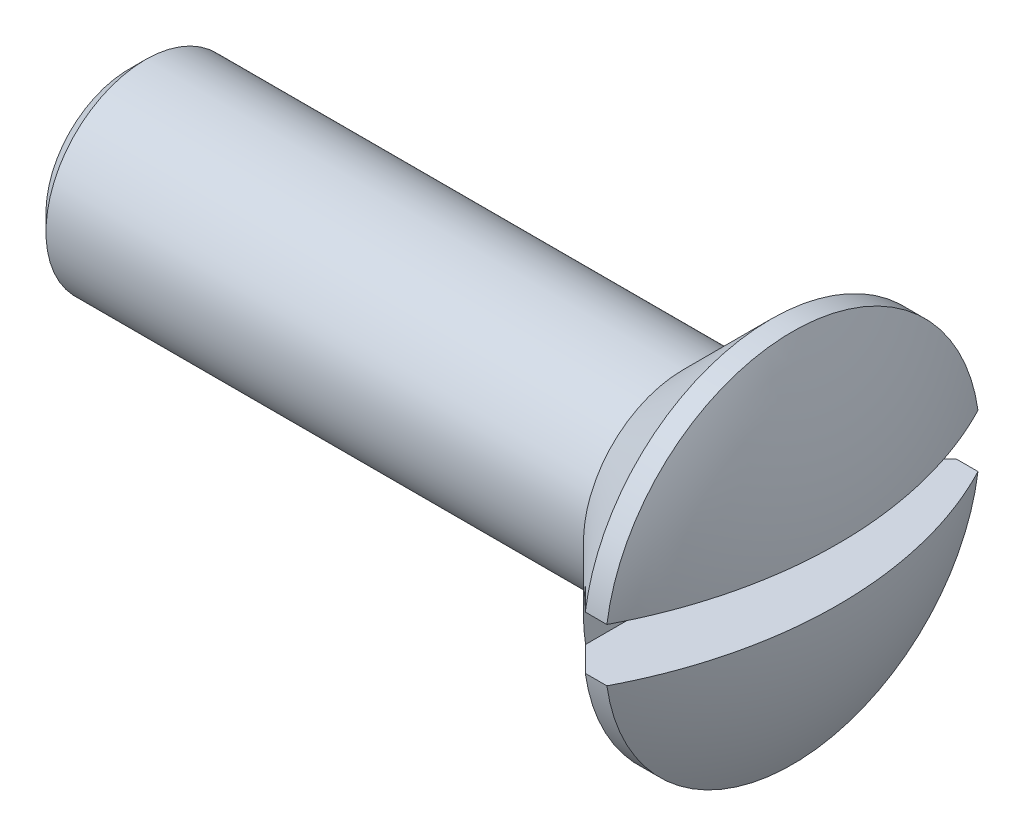
ISO-10303-21;
HEADER;
FILE_DESCRIPTION(('STEP AP214'),'2;1');
FILE_NAME('part.step','',(''),(''),'','','');
FILE_SCHEMA(('AUTOMOTIVE_DESIGN { 1 0 10303 214 1 1 1 1 }'));
ENDSEC;
DATA;
#1=APPLICATION_CONTEXT('core data for automotive mechanical design processes');
#2=APPLICATION_PROTOCOL_DEFINITION('international standard','automotive_design',2000,#1);
#3=PRODUCT_CONTEXT('',#1,'mechanical');
#4=PRODUCT('Part','Part','',(#3));
#5=PRODUCT_RELATED_PRODUCT_CATEGORY('part','',(#4));
#6=PRODUCT_DEFINITION_FORMATION('','',#4);
#7=PRODUCT_DEFINITION_CONTEXT('part definition',#1,'design');
#8=PRODUCT_DEFINITION('design','',#6,#7);
#9=PRODUCT_DEFINITION_SHAPE('','',#8);
#10=(LENGTH_UNIT() NAMED_UNIT(*) SI_UNIT(.MILLI.,.METRE.));
#11=(NAMED_UNIT(*) PLANE_ANGLE_UNIT() SI_UNIT($,.RADIAN.));
#12=(NAMED_UNIT(*) SI_UNIT($,.STERADIAN.) SOLID_ANGLE_UNIT());
#13=UNCERTAINTY_MEASURE_WITH_UNIT(LENGTH_MEASURE(1.E-05),#10,'distance_accuracy_value','');
#14=(GEOMETRIC_REPRESENTATION_CONTEXT(3) GLOBAL_UNCERTAINTY_ASSIGNED_CONTEXT((#13)) GLOBAL_UNIT_ASSIGNED_CONTEXT((#10,
#11,#12)) REPRESENTATION_CONTEXT('',''));
#15=CARTESIAN_POINT('',(0.,0.,0.));
#16=DIRECTION('',(0.,0.,1.));
#17=DIRECTION('',(1.,0.,0.));
#18=AXIS2_PLACEMENT_3D('',#15,#16,#17);
#19=CARTESIAN_POINT('',(-12.1008928571429,0.,0.));
#20=DIRECTION('',(1.,0.,0.));
#21=DIRECTION('',(0.,-1.,0.));
#22=AXIS2_PLACEMENT_3D('',#19,#20,#21);
#23=SPHERICAL_SURFACE('',#22,12.1008928571429);
#24=CARTESIAN_POINT('',(-12.1008928571429,0.8,0.));
#25=DIRECTION('',(0.,1.,0.));
#26=DIRECTION('',(0.,0.,1.));
#27=AXIS2_PLACEMENT_3D('',#24,#25,#26);
#28=CIRCLE('',#27,12.0744195694887);
#29=CARTESIAN_POINT('',(-1.4,0.8,-5.593076076722));
#30=VERTEX_POINT('',#29);
#31=CARTESIAN_POINT('',(-1.4,0.799999999999999,5.59307607672201));
#32=VERTEX_POINT('',#31);
#33=EDGE_CURVE('E181',#30,#32,#28,.F.);
#34=ORIENTED_EDGE('',*,*,#33,.F.);
#35=CARTESIAN_POINT('',(-1.4,0.,0.));
#36=DIRECTION('',(1.,0.,0.));
#37=DIRECTION('',(0.,1.,0.));
#38=AXIS2_PLACEMENT_3D('',#35,#36,#37);
#39=CIRCLE('',#38,5.65);
#40=EDGE_CURVE('E172',#30,#32,#39,.T.);
#41=ORIENTED_EDGE('',*,*,#40,.T.);
#42=EDGE_LOOP('',(#34,#41));
#43=FACE_BOUND('',#42,.T.);
#44=ADVANCED_FACE('F36',(#43),#23,.T.);
#45=CARTESIAN_POINT('',(0.,0.,0.));
#46=DIRECTION('',(1.,0.,0.));
#47=DIRECTION('',(0.,1.,0.));
#48=AXIS2_PLACEMENT_3D('',#45,#46,#47);
#49=CYLINDRICAL_SURFACE('',#48,5.65);
#50=DIRECTION('',(1.,0.,0.));
#51=VECTOR('',#50,1.);
#52=CARTESIAN_POINT('',(0.,0.799999999999999,5.593076076722));
#53=LINE('',#52,#51);
#54=CARTESIAN_POINT('',(-2.04999999999997,0.799999999999999,5.593076076722));
#55=VERTEX_POINT('',#54);
#56=EDGE_CURVE('E59',#32,#55,#53,.F.);
#57=ORIENTED_EDGE('',*,*,#56,.F.);
#58=ORIENTED_EDGE('',*,*,#40,.F.);
#59=DIRECTION('',(1.,0.,0.));
#60=VECTOR('',#59,1.);
#61=CARTESIAN_POINT('',(0.,0.800000000000001,-5.593076076722));
#62=LINE('',#61,#60);
#63=CARTESIAN_POINT('',(-2.04999999999997,0.800000000000001,-5.59307607672201));
#64=VERTEX_POINT('',#63);
#65=EDGE_CURVE('E183',#64,#30,#62,.T.);
#66=ORIENTED_EDGE('',*,*,#65,.F.);
#67=CARTESIAN_POINT('',(-2.04999999999997,0.,0.));
#68=DIRECTION('',(1.,0.,0.));
#69=DIRECTION('',(0.,1.,0.));
#70=AXIS2_PLACEMENT_3D('',#67,#68,#69);
#71=CIRCLE('',#70,5.65);
#72=EDGE_CURVE('E110',#64,#55,#71,.T.);
#73=ORIENTED_EDGE('',*,*,#72,.T.);
#74=EDGE_LOOP('',(#57,#58,#66,#73));
#75=FACE_BOUND('',#74,.T.);
#76=ADVANCED_FACE('F149',(#75),#49,.T.);
#77=CARTESIAN_POINT('',(-12.1008928571429,-0.800000000000001,0.));
#78=DIRECTION('',(0.,-1.,0.));
#79=DIRECTION('',(0.,0.,-1.));
#80=AXIS2_PLACEMENT_3D('',#77,#78,#79);
#81=CIRCLE('',#80,12.0744195694887);
#82=CARTESIAN_POINT('',(-1.4,-0.800000000000001,5.593076076722));
#83=VERTEX_POINT('',#82);
#84=CARTESIAN_POINT('',(-1.4,-0.800000000000001,-5.59307607672201));
#85=VERTEX_POINT('',#84);
#86=EDGE_CURVE('E165',#83,#85,#81,.F.);
#87=ORIENTED_EDGE('',*,*,#86,.F.);
#88=EDGE_CURVE('E97',#83,#85,#39,.T.);
#89=ORIENTED_EDGE('',*,*,#88,.T.);
#90=EDGE_LOOP('',(#87,#89));
#91=FACE_BOUND('',#90,.T.);
#92=ADVANCED_FACE('F151',(#91),#23,.T.);
#93=DIRECTION('',(1.,0.,0.));
#94=VECTOR('',#93,1.);
#95=CARTESIAN_POINT('',(0.,-0.800000000000001,-5.593076076722));
#96=LINE('',#95,#94);
#97=CARTESIAN_POINT('',(-2.04999999999997,-0.800000000000001,-5.593076076722));
#98=VERTEX_POINT('',#97);
#99=EDGE_CURVE('E168',#85,#98,#96,.F.);
#100=ORIENTED_EDGE('',*,*,#99,.F.);
#101=ORIENTED_EDGE('',*,*,#88,.F.);
#102=DIRECTION('',(1.,0.,0.));
#103=VECTOR('',#102,1.);
#104=CARTESIAN_POINT('',(0.,-0.800000000000001,5.593076076722));
#105=LINE('',#104,#103);
#106=CARTESIAN_POINT('',(-2.04999999999997,-0.800000000000001,5.59307607672201));
#107=VERTEX_POINT('',#106);
#108=EDGE_CURVE('E104',#107,#83,#105,.T.);
#109=ORIENTED_EDGE('',*,*,#108,.F.);
#110=EDGE_CURVE('E174',#107,#98,#71,.T.);
#111=ORIENTED_EDGE('',*,*,#110,.T.);
#112=EDGE_LOOP('',(#100,#101,#109,#111));
#113=FACE_BOUND('',#112,.T.);
#114=ADVANCED_FACE('F146',(#113),#49,.T.);
#115=CARTESIAN_POINT('',(-2.04999999999997,0.,0.));
#116=DIRECTION('',(1.,0.,0.));
#117=DIRECTION('',(0.,1.,0.));
#118=AXIS2_PLACEMENT_3D('',#115,#116,#117);
#119=CONICAL_SURFACE('',#118,5.65,0.785398163397443);
#120=CARTESIAN_POINT('',(4.74511721803882,0.799999999999998,12.4193777046486));
#121=CARTESIAN_POINT('',(4.31965428081456,0.799999999999998,11.9930261174784));
#122=CARTESIAN_POINT('',(3.89423019783678,0.799999999999998,11.5666357327711));
#123=CARTESIAN_POINT('',(3.04350138460033,0.799999999999999,10.7137200151019));
#124=CARTESIAN_POINT('',(2.618196656722,0.799999999999999,10.2871946797658));
#125=CARTESIAN_POINT('',(1.76761959018061,0.799999999999999,9.43382265086454));
#126=CARTESIAN_POINT('',(1.34234731165592,0.799999999999999,9.00697589734771));
#127=CARTESIAN_POINT('',(0.492080541455805,0.799999999999999,8.15302128871153));
#128=CARTESIAN_POINT('',(0.0670860448579515,0.799999999999999,7.72591343849361));
#129=CARTESIAN_POINT('',(-0.78963684892412,0.799999999999999,6.86406659123412));
#130=CARTESIAN_POINT('',(-1.2213579628236,0.799999999999999,6.429320349768));
#131=CARTESIAN_POINT('',(-1.86834723495549,0.799999999999999,5.77658920407237));
#132=CARTESIAN_POINT('',(-2.08391769672665,0.799999999999999,5.55890401037255));
#133=CARTESIAN_POINT('',(-2.51476815248159,0.799999999999999,5.12324874008263));
#134=CARTESIAN_POINT('',(-2.73004814809955,0.799999999999999,4.90527866510898));
#135=CARTESIAN_POINT('',(-3.16014687532004,0.799999999999999,4.46896214090299));
#136=CARTESIAN_POINT('',(-3.37496568408039,0.799999999999999,4.25061576779427));
#137=CARTESIAN_POINT('',(-3.80394775538658,0.799999999999999,3.81327065478524));
#138=CARTESIAN_POINT('',(-4.01811100364353,0.799999999999999,3.59427190086775));
#139=CARTESIAN_POINT('',(-4.44532996157782,0.799999999999999,3.15523557952812));
#140=CARTESIAN_POINT('',(-4.65838577961601,0.8,2.93519811792176));
#141=CARTESIAN_POINT('',(-4.97639888685975,0.8,2.60364168362365));
#142=CARTESIAN_POINT('',(-5.08213965232862,0.8,2.49287478015279));
#143=CARTESIAN_POINT('',(-5.29284667886347,0.8,2.27060738855942));
#144=CARTESIAN_POINT('',(-5.39781295004355,0.8,2.15910691005274));
#145=CARTESIAN_POINT('',(-5.55868942682353,0.8,1.98637654903117));
#146=CARTESIAN_POINT('',(-5.61502257289671,0.8,1.92554080526949));
#147=CARTESIAN_POINT('',(-5.7272199889609,0.8,1.80345308435218));
#148=CARTESIAN_POINT('',(-5.78308432176076,0.8,1.74220116500932));
#149=CARTESIAN_POINT('',(-5.89413663694359,0.8,1.61920981712621));
#150=CARTESIAN_POINT('',(-5.9493253013881,0.8,1.55747100535111));
#151=CARTESIAN_POINT('',(-6.05888369735553,0.8,1.43322225898995));
#152=CARTESIAN_POINT('',(-6.11325307835141,0.8,1.37071201405123));
#153=CARTESIAN_POINT('',(-6.2051355945914,0.8,1.26299679876909));
#154=CARTESIAN_POINT('',(-6.24294999126803,0.8,1.21804923332391));
#155=CARTESIAN_POINT('',(-6.31776697990897,0.8,1.12748441978479));
#156=CARTESIAN_POINT('',(-6.35476960976467,0.8,1.08186720311521));
#157=CARTESIAN_POINT('',(-6.42764540486493,0.8,0.989787004296026));
#158=CARTESIAN_POINT('',(-6.46351933039841,0.8,0.943324626242543));
#159=CARTESIAN_POINT('',(-6.53371099529902,0.8,0.849243952042077));
#160=CARTESIAN_POINT('',(-6.56802909538034,0.8,0.801625927800229));
#161=CARTESIAN_POINT('',(-6.62534497472906,0.8,0.718009680275494));
#162=CARTESIAN_POINT('',(-6.64887916280529,0.8,0.682381084873747));
#163=CARTESIAN_POINT('',(-6.69431930071865,0.8,0.610071066089829));
#164=CARTESIAN_POINT('',(-6.71622460122795,0.8,0.573389230843016));
#165=CARTESIAN_POINT('',(-6.75772214328742,0.8,0.498842623233365));
#166=CARTESIAN_POINT('',(-6.77732012108295,0.8,0.460981093679832));
#167=CARTESIAN_POINT('',(-6.81335502284584,0.8,0.383800793568388));
#168=CARTESIAN_POINT('',(-6.82979476967974,0.8,0.344483362166101));
#169=CARTESIAN_POINT('',(-6.86080824970358,0.8,0.257246564055197));
#170=CARTESIAN_POINT('',(-6.87455984774782,0.8,0.209020647026232));
#171=CARTESIAN_POINT('',(-6.8937443017867,0.8,0.111028625146763));
#172=CARTESIAN_POINT('',(-6.8992079262586,0.8,0.061268920182349));
#173=CARTESIAN_POINT('',(-6.90063200223829,0.8,-0.0386352838175578));
#174=CARTESIAN_POINT('',(-6.896547030816,0.8,-0.088780486439219));
#175=CARTESIAN_POINT('',(-6.87974801427453,0.8,-0.187657442577815));
#176=CARTESIAN_POINT('',(-6.86700822610088,0.8,-0.236384525830764));
#177=CARTESIAN_POINT('',(-6.83440007195934,0.8,-0.333895648179295));
#178=CARTESIAN_POINT('',(-6.81421894717466,0.8,-0.382570201245262));
#179=CARTESIAN_POINT('',(-6.76915839209305,0.8,-0.477730851740294));
#180=CARTESIAN_POINT('',(-6.74427023771472,0.8,-0.524212682023572));
#181=CARTESIAN_POINT('',(-6.69118485707923,0.8,-0.615715711259509));
#182=CARTESIAN_POINT('',(-6.66296252652258,0.8,-0.660722079875186));
#183=CARTESIAN_POINT('',(-6.60441466956097,0.8,-0.749270842542499));
#184=CARTESIAN_POINT('',(-6.57409101625924,0.8,-0.792814490318945));
#185=CARTESIAN_POINT('',(-6.50916500430662,0.8,-0.882688386326956));
#186=CARTESIAN_POINT('',(-6.47442309355845,0.8,-0.928917111859847));
#187=CARTESIAN_POINT('',(-6.40369359299834,0.8,-1.020414939396));
#188=CARTESIAN_POINT('',(-6.36770583696376,0.8,-1.06568391203822));
#189=CARTESIAN_POINT('',(-6.25837390257271,0.8,-1.20044803741514));
#190=CARTESIAN_POINT('',(-6.18369408583194,0.8,-1.28885621705901));
#191=CARTESIAN_POINT('',(-6.03218900720606,0.8,-1.46406956516393));
#192=CARTESIAN_POINT('',(-5.95536013554961,0.8,-1.55087157206465));
#193=CARTESIAN_POINT('',(-5.80044200408463,0.8,-1.7232967265519));
#194=CARTESIAN_POINT('',(-5.72235311046476,0.8,-1.80892020370154));
#195=CARTESIAN_POINT('',(-5.56557313070317,0.8,-1.97910707253248));
#196=CARTESIAN_POINT('',(-5.48688476050643,0.8,-2.0636729747183));
#197=CARTESIAN_POINT('',(-5.32890649963365,0.8,-2.23225181172137));
#198=CARTESIAN_POINT('',(-5.24961656615959,0.8,-2.31626470638572));
#199=CARTESIAN_POINT('',(-5.09068838648789,0.8,-2.48378883237718));
#200=CARTESIAN_POINT('',(-5.01105060497988,0.8,-2.56730050505255));
#201=CARTESIAN_POINT('',(-4.85145101596008,0.8,-2.73400954986337));
#202=CARTESIAN_POINT('',(-4.77148921635787,0.8,-2.81720692957635));
#203=CARTESIAN_POINT('',(-4.53194285830772,0.8,-3.06570369800665));
#204=CARTESIAN_POINT('',(-4.37199116453664,0.8,-3.2306490556862));
#205=CARTESIAN_POINT('',(-4.05147042474374,0.8,-3.55993915125416));
#206=CARTESIAN_POINT('',(-3.89090137619788,0.8,-3.7242838866816));
#207=CARTESIAN_POINT('',(-3.40857672940065,0.8,-4.21672523304258));
#208=CARTESIAN_POINT('',(-3.08620970625256,0.8,-4.5442227183829));
#209=CARTESIAN_POINT('',(-2.44051808318878,0.8,-5.1985440376961));
#210=CARTESIAN_POINT('',(-2.11719313614472,0.800000000000001,-5.52536752845678));
#211=CARTESIAN_POINT('',(-1.47005512418724,0.800000000000001,-6.17852514292794));
#212=CARTESIAN_POINT('',(-1.14624206363371,0.800000000000001,-6.50485927095814));
#213=CARTESIAN_POINT('',(-0.498300290172085,0.800000000000001,-7.15722750433832));
#214=CARTESIAN_POINT('',(-0.174171570767393,0.800000000000001,-7.48326160323279));
#215=CARTESIAN_POINT('',(0.474296117584435,0.800000000000001,-8.13512214110996));
#216=CARTESIAN_POINT('',(0.798635087020347,0.800000000000001,-8.46094857960639));
#217=CARTESIAN_POINT('',(1.77180053441267,0.800000000000001,-9.43814275340889));
#218=CARTESIAN_POINT('',(2.42084408883513,0.800000000000001,-10.089294290581));
#219=CARTESIAN_POINT('',(3.20961021995901,0.800000000000001,-10.88024332919));
#220=CARTESIAN_POINT('',(3.34918416051201,0.800000000000001,-11.0201891314621));
#221=CARTESIAN_POINT('',(3.62834785708027,0.800000000000001,-11.3000693616298));
#222=CARTESIAN_POINT('',(3.76793761331009,0.800000000000001,-11.4400037893113));
#223=CARTESIAN_POINT('',(4.04712055068098,0.800000000000001,-11.7198521163181));
#224=CARTESIAN_POINT('',(4.18671373108782,0.800000000000001,-11.8597660163758));
#225=CARTESIAN_POINT('',(4.46590873012772,0.800000000000001,-12.139580792689));
#226=CARTESIAN_POINT('',(4.60551054858975,0.800000000000001,-12.2794816691152));
#227=CARTESIAN_POINT('',(4.74511721803882,0.800000000000001,-12.4193777046486));
#228=B_SPLINE_CURVE_WITH_KNOTS('',3,(#120,#121,#122,#123,#124,#125,#126,#127,#128,#129,#130,
#131,#132,#133,#134,#135,#136,#137,#138,#139,#140,#141,#142,#143,#144,#145,#146,#147,#148,#149,
#150,#151,#152,#153,#154,#155,#156,#157,#158,#159,#160,#161,#162,#163,#164,#165,#166,#167,#168,
#169,#170,#171,#172,#173,#174,#175,#176,#177,#178,#179,#180,#181,#182,#183,#184,#185,#186,#187,
#188,#189,#190,#191,#192,#193,#194,#195,#196,#197,#198,#199,#200,#201,#202,#203,#204,#205,#206,
#207,#208,#209,#210,#211,#212,#213,#214,#215,#216,#217,#218,#219,#220,#221,#222,#223,#224,#225,
#226,#227),.UNSPECIFIED.,.F.,.F.,(4,2,2,2,2,2,2,2,2,2,2,2,2,2,2,2,2,2,2,2,2,2,2,2,2,2,2,2,2,2,2,
2,2,2,2,2,2,2,2,2,2,2,2,2,2,2,2,2,2,2,2,2,2,4),(0.,1.80697248490011,3.61397875582152,
5.42159918859865,7.22918667047184,9.06725200042542,9.98633678885604,10.905416384759,
11.8243278948188,12.7432592932796,13.6620990155401,14.1215028247628,14.5809006239894,
14.8296351425722,15.0783357873934,15.3267603101018,15.5752882636484,15.7514970614197,
15.9276976166011,16.1037768261759,16.279815001247,16.4078816960601,16.5359991717675,
16.663791089444,16.7914682481759,16.9413565033334,17.0906869359896,17.2407291822401,
17.391219682418,17.5489321863173,17.7069399135551,17.8662239005987,18.0253676855117,
18.1988222163427,18.3722999796253,18.7194208466329,19.0671646694091,19.4148091885248,
19.7613446235477,20.1079049483285,20.4540936403047,20.8002739317796,21.4895630232171,
22.1788549357825,23.5574649448377,24.9366576112049,26.3158380305883,27.695047461635,
29.0742601105742,31.8323937662066,32.4253452100396,33.0183059969787,33.6112304428302,
34.2041455344664),.UNSPECIFIED.);
#229=CARTESIAN_POINT('',(-2.8,0.799999999999999,4.83425278610871));
#230=VERTEX_POINT('',#229);
#231=EDGE_CURVE('E103',#55,#230,#228,.T.);
#232=ORIENTED_EDGE('',*,*,#231,.F.);
#233=ORIENTED_EDGE('',*,*,#72,.F.);
#234=CARTESIAN_POINT('',(-2.8,0.8,-4.83425278610871));
#235=VERTEX_POINT('',#234);
#236=EDGE_CURVE('E101',#235,#64,#228,.T.);
#237=ORIENTED_EDGE('',*,*,#236,.F.);
#238=CARTESIAN_POINT('',(-2.8,0.,0.));
#239=DIRECTION('',(1.,0.,0.));
#240=DIRECTION('',(0.,0.,-1.));
#241=AXIS2_PLACEMENT_3D('',#238,#239,#240);
#242=CIRCLE('',#241,4.89999999999998);
#243=CARTESIAN_POINT('',(-2.8,-0.800000000000001,-4.83425278610871));
#244=VERTEX_POINT('',#243);
#245=EDGE_CURVE('E88',#235,#244,#242,.F.);
#246=ORIENTED_EDGE('',*,*,#245,.T.);
#247=CARTESIAN_POINT('',(4.74511721803882,-0.800000000000001,-12.4193777046486));
#248=CARTESIAN_POINT('',(4.31965428081456,-0.800000000000001,-11.9930261174784));
#249=CARTESIAN_POINT('',(3.89423019783678,-0.800000000000001,-11.5666357327711));
#250=CARTESIAN_POINT('',(3.04350138460033,-0.800000000000001,-10.7137200151019));
#251=CARTESIAN_POINT('',(2.618196656722,-0.800000000000001,-10.2871946797658));
#252=CARTESIAN_POINT('',(1.76761959018061,-0.800000000000001,-9.43382265086454));
#253=CARTESIAN_POINT('',(1.34234731165592,-0.800000000000001,-9.00697589734771));
#254=CARTESIAN_POINT('',(0.492080541455804,-0.800000000000001,-8.15302128871153));
#255=CARTESIAN_POINT('',(0.0670860448579505,-0.800000000000001,-7.72591343849361));
#256=CARTESIAN_POINT('',(-0.789636848924121,-0.800000000000001,-6.86406659123412));
#257=CARTESIAN_POINT('',(-1.2213579628236,-0.800000000000001,-6.429320349768));
#258=CARTESIAN_POINT('',(-1.86834723495549,-0.800000000000001,-5.77658920407237));
#259=CARTESIAN_POINT('',(-2.08391769672665,-0.800000000000001,-5.55890401037255));
#260=CARTESIAN_POINT('',(-2.51476815248159,-0.800000000000001,-5.12324874008263));
#261=CARTESIAN_POINT('',(-2.73004814809955,-0.800000000000001,-4.90527866510898));
#262=CARTESIAN_POINT('',(-3.16014687532004,-0.800000000000001,-4.46896214090299));
#263=CARTESIAN_POINT('',(-3.37496568408039,-0.800000000000001,-4.25061576779427));
#264=CARTESIAN_POINT('',(-3.80394775538658,-0.800000000000001,-3.81327065478524));
#265=CARTESIAN_POINT('',(-4.01811100364353,-0.800000000000001,-3.59427190086775));
#266=CARTESIAN_POINT('',(-4.44532996157782,-0.800000000000001,-3.15523557952812));
#267=CARTESIAN_POINT('',(-4.65838577961601,-0.800000000000001,-2.93519811792176));
#268=CARTESIAN_POINT('',(-4.97639888685975,-0.800000000000001,-2.60364168362365));
#269=CARTESIAN_POINT('',(-5.08213965232862,-0.800000000000001,-2.49287478015279));
#270=CARTESIAN_POINT('',(-5.29284667886347,-0.800000000000001,-2.27060738855942));
#271=CARTESIAN_POINT('',(-5.39781295004355,-0.800000000000001,-2.15910691005274));
#272=CARTESIAN_POINT('',(-5.55868942682353,-0.800000000000001,-1.98637654903117));
#273=CARTESIAN_POINT('',(-5.61502257289671,-0.800000000000001,-1.92554080526949));
#274=CARTESIAN_POINT('',(-5.7272199889609,-0.800000000000001,-1.80345308435218));
#275=CARTESIAN_POINT('',(-5.78308432176076,-0.800000000000001,-1.74220116500932));
#276=CARTESIAN_POINT('',(-5.89413663694359,-0.800000000000001,-1.61920981712621));
#277=CARTESIAN_POINT('',(-5.9493253013881,-0.800000000000001,-1.55747100535111));
#278=CARTESIAN_POINT('',(-6.05888369735553,-0.800000000000001,-1.43322225898995));
#279=CARTESIAN_POINT('',(-6.11325307835141,-0.800000000000001,-1.37071201405123));
#280=CARTESIAN_POINT('',(-6.2051355945914,-0.800000000000001,-1.26299679876909));
#281=CARTESIAN_POINT('',(-6.24294999126803,-0.800000000000001,-1.21804923332391));
#282=CARTESIAN_POINT('',(-6.31776697990898,-0.800000000000001,-1.12748441978479));
#283=CARTESIAN_POINT('',(-6.35476960976467,-0.800000000000001,-1.08186720311521));
#284=CARTESIAN_POINT('',(-6.42764540486494,-0.800000000000001,-0.989787004296026));
#285=CARTESIAN_POINT('',(-6.46351933039841,-0.800000000000001,-0.943324626242543));
#286=CARTESIAN_POINT('',(-6.53371099529903,-0.800000000000001,-0.849243952042077));
#287=CARTESIAN_POINT('',(-6.56802909538034,-0.800000000000001,-0.801625927800229));
#288=CARTESIAN_POINT('',(-6.62534497472906,-0.800000000000001,-0.718009680275494));
#289=CARTESIAN_POINT('',(-6.64887916280529,-0.800000000000001,-0.682381084873747));
#290=CARTESIAN_POINT('',(-6.69431930071865,-0.800000000000001,-0.61007106608983));
#291=CARTESIAN_POINT('',(-6.71622460122795,-0.800000000000001,-0.573389230843017));
#292=CARTESIAN_POINT('',(-6.75772214328743,-0.800000000000001,-0.498842623233365));
#293=CARTESIAN_POINT('',(-6.77732012108295,-0.800000000000001,-0.460981093679832));
#294=CARTESIAN_POINT('',(-6.81335502284584,-0.800000000000001,-0.383800793568388));
#295=CARTESIAN_POINT('',(-6.82979476967974,-0.800000000000001,-0.344483362166101));
#296=CARTESIAN_POINT('',(-6.86080824970358,-0.800000000000001,-0.257246564055196));
#297=CARTESIAN_POINT('',(-6.87455984774782,-0.800000000000001,-0.20902064702623));
#298=CARTESIAN_POINT('',(-6.8937443017867,-0.800000000000001,-0.111028625146761));
#299=CARTESIAN_POINT('',(-6.8992079262586,-0.800000000000001,-0.0612689201823483));
#300=CARTESIAN_POINT('',(-6.90063200223829,-0.800000000000001,0.0386352838175572));
#301=CARTESIAN_POINT('',(-6.896547030816,-0.800000000000001,0.0887804864392184));
#302=CARTESIAN_POINT('',(-6.87974801427453,-0.800000000000001,0.187657442577814));
#303=CARTESIAN_POINT('',(-6.86700822610088,-0.800000000000001,0.236384525830763));
#304=CARTESIAN_POINT('',(-6.83440007195934,-0.800000000000001,0.333895648179293));
#305=CARTESIAN_POINT('',(-6.81421894717466,-0.800000000000001,0.382570201245259));
#306=CARTESIAN_POINT('',(-6.76915839209306,-0.800000000000001,0.47773085174029));
#307=CARTESIAN_POINT('',(-6.74427023771473,-0.800000000000001,0.524212682023569));
#308=CARTESIAN_POINT('',(-6.69118485707923,-0.800000000000001,0.615715711259507));
#309=CARTESIAN_POINT('',(-6.66296252652258,-0.800000000000001,0.660722079875185));
#310=CARTESIAN_POINT('',(-6.60441466956097,-0.800000000000001,0.749270842542498));
#311=CARTESIAN_POINT('',(-6.57409101625924,-0.800000000000001,0.792814490318944));
#312=CARTESIAN_POINT('',(-6.50916500430662,-0.800000000000001,0.882688386326953));
#313=CARTESIAN_POINT('',(-6.47442309355845,-0.800000000000001,0.928917111859842));
#314=CARTESIAN_POINT('',(-6.40369359299834,-0.800000000000001,1.020414939396));
#315=CARTESIAN_POINT('',(-6.36770583696376,-0.800000000000001,1.06568391203822));
#316=CARTESIAN_POINT('',(-6.25837390257271,-0.800000000000001,1.20044803741514));
#317=CARTESIAN_POINT('',(-6.18369408583195,-0.800000000000001,1.28885621705901));
#318=CARTESIAN_POINT('',(-6.03218900720606,-0.800000000000001,1.46406956516393));
#319=CARTESIAN_POINT('',(-5.95536013554962,-0.800000000000001,1.55087157206465));
#320=CARTESIAN_POINT('',(-5.80044200408464,-0.800000000000001,1.72329672655189));
#321=CARTESIAN_POINT('',(-5.72235311046476,-0.800000000000001,1.80892020370153));
#322=CARTESIAN_POINT('',(-5.56557313070317,-0.800000000000001,1.97910707253247));
#323=CARTESIAN_POINT('',(-5.48688476050644,-0.800000000000001,2.06367297471829));
#324=CARTESIAN_POINT('',(-5.32890649963366,-0.800000000000001,2.23225181172136));
#325=CARTESIAN_POINT('',(-5.2496165661596,-0.800000000000001,2.31626470638571));
#326=CARTESIAN_POINT('',(-5.09068838648789,-0.800000000000001,2.48378883237717));
#327=CARTESIAN_POINT('',(-5.01105060497989,-0.800000000000001,2.56730050505255));
#328=CARTESIAN_POINT('',(-4.85145101596009,-0.800000000000001,2.73400954986336));
#329=CARTESIAN_POINT('',(-4.77148921635788,-0.800000000000001,2.81720692957633));
#330=CARTESIAN_POINT('',(-4.53194285830773,-0.800000000000001,3.06570369800664));
#331=CARTESIAN_POINT('',(-4.37199116453665,-0.800000000000001,3.23064905568619));
#332=CARTESIAN_POINT('',(-4.05147042474375,-0.800000000000001,3.55993915125415));
#333=CARTESIAN_POINT('',(-3.8909013761979,-0.800000000000001,3.72428388668158));
#334=CARTESIAN_POINT('',(-3.40857672940067,-0.800000000000001,4.21672523304256));
#335=CARTESIAN_POINT('',(-3.08620970625258,-0.800000000000001,4.54422271838288));
#336=CARTESIAN_POINT('',(-2.4405180831888,-0.800000000000001,5.19854403769607));
#337=CARTESIAN_POINT('',(-2.11719313614474,-0.800000000000001,5.52536752845676));
#338=CARTESIAN_POINT('',(-1.47005512418726,-0.800000000000001,6.17852514292792));
#339=CARTESIAN_POINT('',(-1.14624206363373,-0.800000000000001,6.50485927095812));
#340=CARTESIAN_POINT('',(-0.498300290172115,-0.800000000000001,7.15722750433829));
#341=CARTESIAN_POINT('',(-0.174171570767423,-0.800000000000001,7.48326160323276));
#342=CARTESIAN_POINT('',(0.474296117584403,-0.800000000000001,8.13512214110993));
#343=CARTESIAN_POINT('',(0.798635087020315,-0.800000000000001,8.46094857960636));
#344=CARTESIAN_POINT('',(1.77180053441263,-0.800000000000001,9.43814275340885));
#345=CARTESIAN_POINT('',(2.42084408883509,-0.800000000000001,10.089294290581));
#346=CARTESIAN_POINT('',(3.20961021995898,-0.800000000000001,10.88024332919));
#347=CARTESIAN_POINT('',(3.34918416051197,-0.800000000000001,11.0201891314621));
#348=CARTESIAN_POINT('',(3.62834785708024,-0.800000000000001,11.3000693616297));
#349=CARTESIAN_POINT('',(3.76793761331006,-0.800000000000001,11.4400037893113));
#350=CARTESIAN_POINT('',(4.04712055068096,-0.800000000000001,11.7198521163181));
#351=CARTESIAN_POINT('',(4.1867137310878,-0.800000000000001,11.8597660163758));
#352=CARTESIAN_POINT('',(4.46590873012771,-0.800000000000001,12.139580792689));
#353=CARTESIAN_POINT('',(4.60551054858975,-0.800000000000001,12.2794816691152));
#354=CARTESIAN_POINT('',(4.74511721803882,-0.800000000000001,12.4193777046486));
#355=B_SPLINE_CURVE_WITH_KNOTS('',3,(#247,#248,#249,#250,#251,#252,#253,#254,#255,#256,#257,
#258,#259,#260,#261,#262,#263,#264,#265,#266,#267,#268,#269,#270,#271,#272,#273,#274,#275,#276,
#277,#278,#279,#280,#281,#282,#283,#284,#285,#286,#287,#288,#289,#290,#291,#292,#293,#294,#295,
#296,#297,#298,#299,#300,#301,#302,#303,#304,#305,#306,#307,#308,#309,#310,#311,#312,#313,#314,
#315,#316,#317,#318,#319,#320,#321,#322,#323,#324,#325,#326,#327,#328,#329,#330,#331,#332,#333,
#334,#335,#336,#337,#338,#339,#340,#341,#342,#343,#344,#345,#346,#347,#348,#349,#350,#351,#352,
#353,#354),.UNSPECIFIED.,.F.,.F.,(4,2,2,2,2,2,2,2,2,2,2,2,2,2,2,2,2,2,2,2,2,2,2,2,2,2,2,2,2,2,2,
2,2,2,2,2,2,2,2,2,2,2,2,2,2,2,2,2,2,2,2,2,2,4),(0.,1.80697248490011,3.61397875582152,
5.42159918859865,7.22918667047185,9.06725200042542,9.98633678885604,10.905416384759,
11.8243278948188,12.7432592932796,13.6620990155401,14.1215028247628,14.5809006239894,
14.8296351425722,15.0783357873934,15.3267603101018,15.5752882636484,15.7514970614197,
15.9276976166011,16.1037768261759,16.279815001247,16.4078816960601,16.5359991717675,
16.663791089444,16.7914682481759,16.9413565033334,17.0906869359896,17.2407291822401,
17.391219682418,17.5489321863173,17.7069399135551,17.8662239005987,18.0253676855117,
18.1988222163427,18.3722999796253,18.7194208466329,19.0671646694091,19.4148091885248,
19.7613446235477,20.1079049483285,20.4540936403047,20.8002739317796,21.489563023217,
22.1788549357825,23.5574649448376,24.9366576112049,26.3158380305883,27.695047461635,
29.0742601105741,31.8323937662065,32.4253452100395,33.0183059969787,33.6112304428302,
34.2041455344664),.UNSPECIFIED.);
#356=EDGE_CURVE('E96',#98,#244,#355,.T.);
#357=ORIENTED_EDGE('',*,*,#356,.F.);
#358=ORIENTED_EDGE('',*,*,#110,.F.);
#359=CARTESIAN_POINT('',(-2.8,-0.800000000000001,4.83425278610871));
#360=VERTEX_POINT('',#359);
#361=EDGE_CURVE('E112',#360,#107,#355,.T.);
#362=ORIENTED_EDGE('',*,*,#361,.F.);
#363=EDGE_CURVE('E99',#360,#230,#242,.F.);
#364=ORIENTED_EDGE('',*,*,#363,.T.);
#365=EDGE_LOOP('',(#232,#233,#237,#246,#357,#358,#362,#364));
#366=FACE_BOUND('',#365,.T.);
#367=CARTESIAN_POINT('',(-4.7,0.,0.));
#368=DIRECTION('',(1.,0.,0.));
#369=DIRECTION('',(0.,1.,0.));
#370=AXIS2_PLACEMENT_3D('',#367,#368,#369);
#371=CIRCLE('',#370,3.);
#372=CARTESIAN_POINT('',(-4.7,3.,0.));
#373=VERTEX_POINT('',#372);
#374=EDGE_CURVE('E177',#373,#373,#371,.T.);
#375=ORIENTED_EDGE('',*,*,#374,.T.);
#376=EDGE_LOOP('',(#375));
#377=FACE_BOUND('',#376,.T.);
#378=ADVANCED_FACE('F107',(#366,#377),#119,.T.);
#379=CARTESIAN_POINT('',(0.,0.,0.));
#380=DIRECTION('',(1.,0.,0.));
#381=DIRECTION('',(0.,1.,0.));
#382=AXIS2_PLACEMENT_3D('',#379,#380,#381);
#383=CYLINDRICAL_SURFACE('',#382,3.);
#384=CARTESIAN_POINT('',(-20.9,0.,0.));
#385=DIRECTION('',(-1.,0.,0.));
#386=DIRECTION('',(0.,-1.,0.));
#387=AXIS2_PLACEMENT_3D('',#384,#385,#386);
#388=CIRCLE('',#387,3.);
#389=CARTESIAN_POINT('',(-20.9,-3.,0.));
#390=VERTEX_POINT('',#389);
#391=EDGE_CURVE('E44',#390,#390,#388,.F.);
#392=ORIENTED_EDGE('',*,*,#391,.T.);
#393=EDGE_LOOP('',(#392));
#394=FACE_BOUND('',#393,.T.);
#395=ORIENTED_EDGE('',*,*,#374,.F.);
#396=EDGE_LOOP('',(#395));
#397=FACE_BOUND('',#396,.T.);
#398=ADVANCED_FACE('F139',(#394,#397),#383,.T.);
#399=CARTESIAN_POINT('',(-21.4,3.,0.));
#400=DIRECTION('',(-1.,0.,0.));
#401=DIRECTION('',(0.,-1.,0.));
#402=AXIS2_PLACEMENT_3D('',#399,#400,#401);
#403=PLANE('',#402);
#404=CARTESIAN_POINT('',(-21.4,0.,0.));
#405=DIRECTION('',(-1.,0.,0.));
#406=DIRECTION('',(0.,-1.,0.));
#407=AXIS2_PLACEMENT_3D('',#404,#405,#406);
#408=CIRCLE('',#407,2.50000000000001);
#409=CARTESIAN_POINT('',(-21.4,-2.50000000000001,0.));
#410=VERTEX_POINT('',#409);
#411=EDGE_CURVE('E11',#410,#410,#408,.T.);
#412=ORIENTED_EDGE('',*,*,#411,.T.);
#413=EDGE_LOOP('',(#412));
#414=FACE_BOUND('',#413,.T.);
#415=ADVANCED_FACE('F137',(#414),#403,.T.);
#416=CARTESIAN_POINT('',(-2.8,0.799999999999999,5.65));
#417=DIRECTION('',(0.,1.,0.));
#418=DIRECTION('',(0.,0.,1.));
#419=AXIS2_PLACEMENT_3D('',#416,#417,#418);
#420=PLANE('',#419);
#421=ORIENTED_EDGE('',*,*,#231,.T.);
#422=DIRECTION('',(0.,0.,1.));
#423=VECTOR('',#422,1.);
#424=CARTESIAN_POINT('',(-2.8,0.799999999999999,5.65));
#425=LINE('',#424,#423);
#426=EDGE_CURVE('E91',#235,#230,#425,.T.);
#427=ORIENTED_EDGE('',*,*,#426,.F.);
#428=ORIENTED_EDGE('',*,*,#236,.T.);
#429=ORIENTED_EDGE('',*,*,#65,.T.);
#430=ORIENTED_EDGE('',*,*,#33,.T.);
#431=ORIENTED_EDGE('',*,*,#56,.T.);
#432=EDGE_LOOP('',(#421,#427,#428,#429,#430,#431));
#433=FACE_BOUND('',#432,.T.);
#434=ADVANCED_FACE('F100',(#433),#420,.F.);
#435=CARTESIAN_POINT('',(-2.8,-0.800000000000001,5.65));
#436=DIRECTION('',(0.,-1.,0.));
#437=DIRECTION('',(0.,0.,-1.));
#438=AXIS2_PLACEMENT_3D('',#435,#436,#437);
#439=PLANE('',#438);
#440=ORIENTED_EDGE('',*,*,#356,.T.);
#441=DIRECTION('',(0.,0.,-1.));
#442=VECTOR('',#441,1.);
#443=CARTESIAN_POINT('',(-2.8,-0.800000000000001,5.65));
#444=LINE('',#443,#442);
#445=EDGE_CURVE('E51',#360,#244,#444,.T.);
#446=ORIENTED_EDGE('',*,*,#445,.F.);
#447=ORIENTED_EDGE('',*,*,#361,.T.);
#448=ORIENTED_EDGE('',*,*,#108,.T.);
#449=ORIENTED_EDGE('',*,*,#86,.T.);
#450=ORIENTED_EDGE('',*,*,#99,.T.);
#451=EDGE_LOOP('',(#440,#446,#447,#448,#449,#450));
#452=FACE_BOUND('',#451,.T.);
#453=ADVANCED_FACE('F131',(#452),#439,.F.);
#454=CARTESIAN_POINT('',(-2.8,-0.800000000000001,5.65));
#455=DIRECTION('',(1.,0.,0.));
#456=DIRECTION('',(0.,0.,-1.));
#457=AXIS2_PLACEMENT_3D('',#454,#455,#456);
#458=PLANE('',#457);
#459=ORIENTED_EDGE('',*,*,#445,.T.);
#460=ORIENTED_EDGE('',*,*,#245,.F.);
#461=ORIENTED_EDGE('',*,*,#426,.T.);
#462=ORIENTED_EDGE('',*,*,#363,.F.);
#463=EDGE_LOOP('',(#459,#460,#461,#462));
#464=FACE_BOUND('',#463,.T.);
#465=ADVANCED_FACE('F90',(#464),#458,.T.);
#466=CARTESIAN_POINT('',(-20.9,0.,0.));
#467=DIRECTION('',(1.,0.,0.));
#468=DIRECTION('',(0.,1.,0.));
#469=AXIS2_PLACEMENT_3D('',#466,#467,#468);
#470=CONICAL_SURFACE('',#469,3.,0.785398163397446);
#471=ORIENTED_EDGE('',*,*,#411,.F.);
#472=EDGE_LOOP('',(#471));
#473=FACE_BOUND('',#472,.T.);
#474=ORIENTED_EDGE('',*,*,#391,.F.);
#475=EDGE_LOOP('',(#474));
#476=FACE_BOUND('',#475,.T.);
#477=ADVANCED_FACE('F38',(#473,#476),#470,.T.);
#478=CLOSED_SHELL('',(#44,#76,#92,#114,#378,#398,#415,#434,#453,#465,#477));
#479=MANIFOLD_SOLID_BREP('B2',#478);
#480=ADVANCED_BREP_SHAPE_REPRESENTATION('',(#18,#479),#14);
#481=SHAPE_DEFINITION_REPRESENTATION(#9,#480);
ENDSEC;
END-ISO-10303-21;
